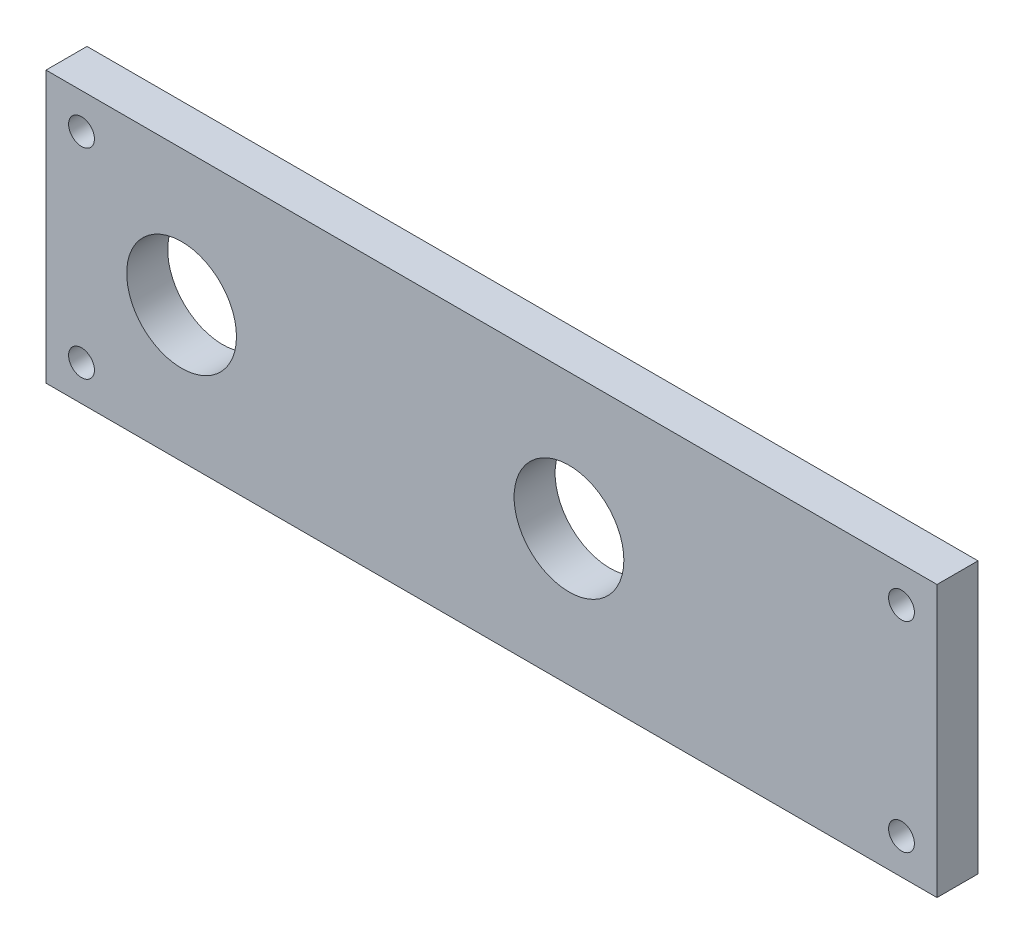
ISO-10303-21;
HEADER;
FILE_DESCRIPTION(('STEP AP214'),'2;1');
FILE_NAME('part.step','',(''),(''),'','','');
FILE_SCHEMA(('AUTOMOTIVE_DESIGN { 1 0 10303 214 1 1 1 1 }'));
ENDSEC;
DATA;
#1=APPLICATION_CONTEXT('core data for automotive mechanical design processes');
#2=APPLICATION_PROTOCOL_DEFINITION('international standard','automotive_design',2000,#1);
#3=PRODUCT_CONTEXT('',#1,'mechanical');
#4=PRODUCT('Part','Part','',(#3));
#5=PRODUCT_RELATED_PRODUCT_CATEGORY('part','',(#4));
#6=PRODUCT_DEFINITION_FORMATION('','',#4);
#7=PRODUCT_DEFINITION_CONTEXT('part definition',#1,'design');
#8=PRODUCT_DEFINITION('design','',#6,#7);
#9=PRODUCT_DEFINITION_SHAPE('','',#8);
#10=(LENGTH_UNIT() NAMED_UNIT(*) SI_UNIT(.MILLI.,.METRE.));
#11=(NAMED_UNIT(*) PLANE_ANGLE_UNIT() SI_UNIT($,.RADIAN.));
#12=(NAMED_UNIT(*) SI_UNIT($,.STERADIAN.) SOLID_ANGLE_UNIT());
#13=UNCERTAINTY_MEASURE_WITH_UNIT(LENGTH_MEASURE(1.E-05),#10,'distance_accuracy_value','');
#14=(GEOMETRIC_REPRESENTATION_CONTEXT(3) GLOBAL_UNCERTAINTY_ASSIGNED_CONTEXT((#13)) GLOBAL_UNIT_ASSIGNED_CONTEXT((#10,
#11,#12)) REPRESENTATION_CONTEXT('',''));
#15=CARTESIAN_POINT('',(0.,0.,0.));
#16=DIRECTION('',(0.,0.,1.));
#17=DIRECTION('',(1.,0.,0.));
#18=AXIS2_PLACEMENT_3D('',#15,#16,#17);
#19=CARTESIAN_POINT('',(0.,0.,3.175));
#20=DIRECTION('',(0.,0.,1.));
#21=DIRECTION('',(1.,0.,0.));
#22=AXIS2_PLACEMENT_3D('',#19,#20,#21);
#23=PLANE('',#22);
#24=CARTESIAN_POINT('',(111.5,15.5,3.175));
#25=DIRECTION('',(0.,0.,1.));
#26=DIRECTION('',(1.,0.,0.));
#27=AXIS2_PLACEMENT_3D('',#24,#25,#26);
#28=CIRCLE('',#27,2.);
#29=CARTESIAN_POINT('',(113.5,15.5,3.175));
#30=VERTEX_POINT('',#29);
#31=EDGE_CURVE('E141',#30,#30,#28,.T.);
#32=ORIENTED_EDGE('',*,*,#31,.F.);
#33=EDGE_LOOP('',(#32));
#34=FACE_BOUND('',#33,.T.);
#35=CARTESIAN_POINT('',(-15.5,15.5,3.175));
#36=DIRECTION('',(0.,0.,1.));
#37=DIRECTION('',(1.,0.,0.));
#38=AXIS2_PLACEMENT_3D('',#35,#36,#37);
#39=CIRCLE('',#38,2.);
#40=CARTESIAN_POINT('',(-13.5,15.5,3.175));
#41=VERTEX_POINT('',#40);
#42=EDGE_CURVE('E129',#41,#41,#39,.T.);
#43=ORIENTED_EDGE('',*,*,#42,.F.);
#44=EDGE_LOOP('',(#43));
#45=FACE_BOUND('',#44,.T.);
#46=CARTESIAN_POINT('',(0.,0.,3.175));
#47=DIRECTION('',(0.,0.,1.));
#48=DIRECTION('',(1.,0.,0.));
#49=AXIS2_PLACEMENT_3D('',#46,#47,#48);
#50=CIRCLE('',#49,8.5);
#51=CARTESIAN_POINT('',(8.5,0.,3.175));
#52=VERTEX_POINT('',#51);
#53=EDGE_CURVE('E108',#52,#52,#50,.T.);
#54=ORIENTED_EDGE('',*,*,#53,.F.);
#55=EDGE_LOOP('',(#54));
#56=FACE_BOUND('',#55,.T.);
#57=DIRECTION('',(0.,-1.,0.));
#58=VECTOR('',#57,1.);
#59=CARTESIAN_POINT('',(-21.,21.,3.175));
#60=LINE('',#59,#58);
#61=CARTESIAN_POINT('',(-21.,21.,3.175));
#62=VERTEX_POINT('',#61);
#63=CARTESIAN_POINT('',(-21.,-21.,3.175));
#64=VERTEX_POINT('',#63);
#65=EDGE_CURVE('E93',#62,#64,#60,.T.);
#66=ORIENTED_EDGE('',*,*,#65,.T.);
#67=DIRECTION('',(1.,0.,0.));
#68=VECTOR('',#67,1.);
#69=CARTESIAN_POINT('',(-21.,-21.,3.175));
#70=LINE('',#69,#68);
#71=CARTESIAN_POINT('',(117.,-21.,3.175));
#72=VERTEX_POINT('',#71);
#73=EDGE_CURVE('E88',#64,#72,#70,.T.);
#74=ORIENTED_EDGE('',*,*,#73,.T.);
#75=DIRECTION('',(0.,1.,0.));
#76=VECTOR('',#75,1.);
#77=CARTESIAN_POINT('',(117.,21.,3.175));
#78=LINE('',#77,#76);
#79=CARTESIAN_POINT('',(117.,21.,3.175));
#80=VERTEX_POINT('',#79);
#81=EDGE_CURVE('E91',#72,#80,#78,.T.);
#82=ORIENTED_EDGE('',*,*,#81,.T.);
#83=DIRECTION('',(-1.,0.,0.));
#84=VECTOR('',#83,1.);
#85=CARTESIAN_POINT('',(-21.,21.,3.175));
#86=LINE('',#85,#84);
#87=EDGE_CURVE('E58',#80,#62,#86,.T.);
#88=ORIENTED_EDGE('',*,*,#87,.T.);
#89=EDGE_LOOP('',(#66,#74,#82,#88));
#90=FACE_BOUND('',#89,.T.);
#91=CARTESIAN_POINT('',(-15.5,-15.5,3.175));
#92=DIRECTION('',(0.,0.,1.));
#93=DIRECTION('',(1.,0.,0.));
#94=AXIS2_PLACEMENT_3D('',#91,#92,#93);
#95=CIRCLE('',#94,2.);
#96=CARTESIAN_POINT('',(-13.5,-15.5,3.175));
#97=VERTEX_POINT('',#96);
#98=EDGE_CURVE('E123',#97,#97,#95,.T.);
#99=ORIENTED_EDGE('',*,*,#98,.F.);
#100=EDGE_LOOP('',(#99));
#101=FACE_BOUND('',#100,.T.);
#102=CARTESIAN_POINT('',(60.,0.,3.175));
#103=DIRECTION('',(0.,0.,1.));
#104=DIRECTION('',(1.,0.,0.));
#105=AXIS2_PLACEMENT_3D('',#102,#103,#104);
#106=CIRCLE('',#105,8.50000000000001);
#107=CARTESIAN_POINT('',(68.5,0.,3.175));
#108=VERTEX_POINT('',#107);
#109=EDGE_CURVE('E135',#108,#108,#106,.T.);
#110=ORIENTED_EDGE('',*,*,#109,.F.);
#111=EDGE_LOOP('',(#110));
#112=FACE_BOUND('',#111,.T.);
#113=CARTESIAN_POINT('',(111.5,-15.5,3.175));
#114=DIRECTION('',(0.,0.,1.));
#115=DIRECTION('',(1.,0.,0.));
#116=AXIS2_PLACEMENT_3D('',#113,#114,#115);
#117=CIRCLE('',#116,2.);
#118=CARTESIAN_POINT('',(113.5,-15.5,3.175));
#119=VERTEX_POINT('',#118);
#120=EDGE_CURVE('E147',#119,#119,#117,.T.);
#121=ORIENTED_EDGE('',*,*,#120,.F.);
#122=EDGE_LOOP('',(#121));
#123=FACE_BOUND('',#122,.T.);
#124=ADVANCED_FACE('F41',(#34,#45,#56,#90,#101,#112,#123),#23,.T.);
#125=CARTESIAN_POINT('',(0.,0.,-3.175));
#126=DIRECTION('',(0.,0.,1.));
#127=DIRECTION('',(1.,0.,0.));
#128=AXIS2_PLACEMENT_3D('',#125,#126,#127);
#129=PLANE('',#128);
#130=DIRECTION('',(0.,-1.,0.));
#131=VECTOR('',#130,1.);
#132=CARTESIAN_POINT('',(-21.,21.,-3.175));
#133=LINE('',#132,#131);
#134=CARTESIAN_POINT('',(-21.,21.,-3.175));
#135=VERTEX_POINT('',#134);
#136=CARTESIAN_POINT('',(-21.,-21.,-3.175));
#137=VERTEX_POINT('',#136);
#138=EDGE_CURVE('E105',#135,#137,#133,.T.);
#139=ORIENTED_EDGE('',*,*,#138,.F.);
#140=DIRECTION('',(-1.,0.,0.));
#141=VECTOR('',#140,1.);
#142=CARTESIAN_POINT('',(-21.,21.,-3.175));
#143=LINE('',#142,#141);
#144=CARTESIAN_POINT('',(117.,21.,-3.175));
#145=VERTEX_POINT('',#144);
#146=EDGE_CURVE('E81',#145,#135,#143,.T.);
#147=ORIENTED_EDGE('',*,*,#146,.F.);
#148=DIRECTION('',(0.,1.,0.));
#149=VECTOR('',#148,1.);
#150=CARTESIAN_POINT('',(117.,21.,-3.175));
#151=LINE('',#150,#149);
#152=CARTESIAN_POINT('',(117.,-21.,-3.175));
#153=VERTEX_POINT('',#152);
#154=EDGE_CURVE('E75',#153,#145,#151,.T.);
#155=ORIENTED_EDGE('',*,*,#154,.F.);
#156=DIRECTION('',(1.,0.,0.));
#157=VECTOR('',#156,1.);
#158=CARTESIAN_POINT('',(-21.,-21.,-3.175));
#159=LINE('',#158,#157);
#160=EDGE_CURVE('E97',#137,#153,#159,.T.);
#161=ORIENTED_EDGE('',*,*,#160,.F.);
#162=EDGE_LOOP('',(#139,#147,#155,#161));
#163=FACE_BOUND('',#162,.T.);
#164=CARTESIAN_POINT('',(0.,0.,-3.175));
#165=DIRECTION('',(0.,0.,1.));
#166=DIRECTION('',(1.,0.,0.));
#167=AXIS2_PLACEMENT_3D('',#164,#165,#166);
#168=CIRCLE('',#167,8.5);
#169=CARTESIAN_POINT('',(8.5,0.,-3.175));
#170=VERTEX_POINT('',#169);
#171=EDGE_CURVE('E120',#170,#170,#168,.T.);
#172=ORIENTED_EDGE('',*,*,#171,.T.);
#173=EDGE_LOOP('',(#172));
#174=FACE_BOUND('',#173,.T.);
#175=CARTESIAN_POINT('',(-15.5,-15.5,-3.175));
#176=DIRECTION('',(0.,0.,1.));
#177=DIRECTION('',(1.,0.,0.));
#178=AXIS2_PLACEMENT_3D('',#175,#176,#177);
#179=CIRCLE('',#178,2.);
#180=CARTESIAN_POINT('',(-13.5,-15.5,-3.175));
#181=VERTEX_POINT('',#180);
#182=EDGE_CURVE('E126',#181,#181,#179,.T.);
#183=ORIENTED_EDGE('',*,*,#182,.T.);
#184=EDGE_LOOP('',(#183));
#185=FACE_BOUND('',#184,.T.);
#186=CARTESIAN_POINT('',(-15.5,15.5,-3.175));
#187=DIRECTION('',(0.,0.,1.));
#188=DIRECTION('',(1.,0.,0.));
#189=AXIS2_PLACEMENT_3D('',#186,#187,#188);
#190=CIRCLE('',#189,2.);
#191=CARTESIAN_POINT('',(-13.5,15.5,-3.175));
#192=VERTEX_POINT('',#191);
#193=EDGE_CURVE('E132',#192,#192,#190,.T.);
#194=ORIENTED_EDGE('',*,*,#193,.T.);
#195=EDGE_LOOP('',(#194));
#196=FACE_BOUND('',#195,.T.);
#197=CARTESIAN_POINT('',(60.,0.,-3.175));
#198=DIRECTION('',(0.,0.,1.));
#199=DIRECTION('',(1.,0.,0.));
#200=AXIS2_PLACEMENT_3D('',#197,#198,#199);
#201=CIRCLE('',#200,8.50000000000001);
#202=CARTESIAN_POINT('',(68.5,0.,-3.175));
#203=VERTEX_POINT('',#202);
#204=EDGE_CURVE('E138',#203,#203,#201,.T.);
#205=ORIENTED_EDGE('',*,*,#204,.T.);
#206=EDGE_LOOP('',(#205));
#207=FACE_BOUND('',#206,.T.);
#208=CARTESIAN_POINT('',(111.5,15.5,-3.175));
#209=DIRECTION('',(0.,0.,1.));
#210=DIRECTION('',(1.,0.,0.));
#211=AXIS2_PLACEMENT_3D('',#208,#209,#210);
#212=CIRCLE('',#211,2.);
#213=CARTESIAN_POINT('',(113.5,15.5,-3.175));
#214=VERTEX_POINT('',#213);
#215=EDGE_CURVE('E144',#214,#214,#212,.T.);
#216=ORIENTED_EDGE('',*,*,#215,.T.);
#217=EDGE_LOOP('',(#216));
#218=FACE_BOUND('',#217,.T.);
#219=CARTESIAN_POINT('',(111.5,-15.5,-3.175));
#220=DIRECTION('',(0.,0.,1.));
#221=DIRECTION('',(1.,0.,0.));
#222=AXIS2_PLACEMENT_3D('',#219,#220,#221);
#223=CIRCLE('',#222,2.);
#224=CARTESIAN_POINT('',(113.5,-15.5,-3.175));
#225=VERTEX_POINT('',#224);
#226=EDGE_CURVE('E150',#225,#225,#223,.T.);
#227=ORIENTED_EDGE('',*,*,#226,.T.);
#228=EDGE_LOOP('',(#227));
#229=FACE_BOUND('',#228,.T.);
#230=ADVANCED_FACE('F116',(#163,#174,#185,#196,#207,#218,#229),#129,.F.);
#231=CARTESIAN_POINT('',(-21.,21.,3.175));
#232=DIRECTION('',(1.,0.,0.));
#233=DIRECTION('',(0.,1.,0.));
#234=AXIS2_PLACEMENT_3D('',#231,#232,#233);
#235=PLANE('',#234);
#236=ORIENTED_EDGE('',*,*,#138,.T.);
#237=DIRECTION('',(0.,0.,-1.));
#238=VECTOR('',#237,1.);
#239=CARTESIAN_POINT('',(-21.,-21.,3.175));
#240=LINE('',#239,#238);
#241=EDGE_CURVE('E11',#64,#137,#240,.T.);
#242=ORIENTED_EDGE('',*,*,#241,.F.);
#243=ORIENTED_EDGE('',*,*,#65,.F.);
#244=DIRECTION('',(0.,0.,-1.));
#245=VECTOR('',#244,1.);
#246=CARTESIAN_POINT('',(-21.,21.,3.175));
#247=LINE('',#246,#245);
#248=EDGE_CURVE('E101',#62,#135,#247,.T.);
#249=ORIENTED_EDGE('',*,*,#248,.T.);
#250=EDGE_LOOP('',(#236,#242,#243,#249));
#251=FACE_BOUND('',#250,.T.);
#252=ADVANCED_FACE('F43',(#251),#235,.F.);
#253=CARTESIAN_POINT('',(-21.,-21.,3.175));
#254=DIRECTION('',(0.,1.,0.));
#255=DIRECTION('',(0.,0.,1.));
#256=AXIS2_PLACEMENT_3D('',#253,#254,#255);
#257=PLANE('',#256);
#258=ORIENTED_EDGE('',*,*,#160,.T.);
#259=DIRECTION('',(0.,0.,-1.));
#260=VECTOR('',#259,1.);
#261=CARTESIAN_POINT('',(117.,-21.,3.175));
#262=LINE('',#261,#260);
#263=EDGE_CURVE('E50',#72,#153,#262,.T.);
#264=ORIENTED_EDGE('',*,*,#263,.F.);
#265=ORIENTED_EDGE('',*,*,#73,.F.);
#266=ORIENTED_EDGE('',*,*,#241,.T.);
#267=EDGE_LOOP('',(#258,#264,#265,#266));
#268=FACE_BOUND('',#267,.T.);
#269=ADVANCED_FACE('F96',(#268),#257,.F.);
#270=CARTESIAN_POINT('',(117.,21.,3.175));
#271=DIRECTION('',(-1.,0.,0.));
#272=DIRECTION('',(0.,-1.,0.));
#273=AXIS2_PLACEMENT_3D('',#270,#271,#272);
#274=PLANE('',#273);
#275=ORIENTED_EDGE('',*,*,#154,.T.);
#276=DIRECTION('',(0.,0.,-1.));
#277=VECTOR('',#276,1.);
#278=CARTESIAN_POINT('',(117.,21.,3.175));
#279=LINE('',#278,#277);
#280=EDGE_CURVE('E98',#80,#145,#279,.T.);
#281=ORIENTED_EDGE('',*,*,#280,.F.);
#282=ORIENTED_EDGE('',*,*,#81,.F.);
#283=ORIENTED_EDGE('',*,*,#263,.T.);
#284=EDGE_LOOP('',(#275,#281,#282,#283));
#285=FACE_BOUND('',#284,.T.);
#286=ADVANCED_FACE('F99',(#285),#274,.F.);
#287=CARTESIAN_POINT('',(-21.,21.,3.175));
#288=DIRECTION('',(0.,-1.,0.));
#289=DIRECTION('',(0.,0.,-1.));
#290=AXIS2_PLACEMENT_3D('',#287,#288,#289);
#291=PLANE('',#290);
#292=ORIENTED_EDGE('',*,*,#146,.T.);
#293=ORIENTED_EDGE('',*,*,#248,.F.);
#294=ORIENTED_EDGE('',*,*,#87,.F.);
#295=ORIENTED_EDGE('',*,*,#280,.T.);
#296=EDGE_LOOP('',(#292,#293,#294,#295));
#297=FACE_BOUND('',#296,.T.);
#298=ADVANCED_FACE('F113',(#297),#291,.F.);
#299=CARTESIAN_POINT('',(0.,0.,3.175));
#300=DIRECTION('',(0.,0.,-1.));
#301=DIRECTION('',(-1.,0.,0.));
#302=AXIS2_PLACEMENT_3D('',#299,#300,#301);
#303=CYLINDRICAL_SURFACE('',#302,8.5);
#304=ORIENTED_EDGE('',*,*,#53,.T.);
#305=EDGE_LOOP('',(#304));
#306=FACE_BOUND('',#305,.T.);
#307=ORIENTED_EDGE('',*,*,#171,.F.);
#308=EDGE_LOOP('',(#307));
#309=FACE_BOUND('',#308,.T.);
#310=ADVANCED_FACE('F169',(#306,#309),#303,.F.);
#311=CARTESIAN_POINT('',(-15.5,-15.5,3.175));
#312=DIRECTION('',(0.,0.,-1.));
#313=DIRECTION('',(-1.,0.,0.));
#314=AXIS2_PLACEMENT_3D('',#311,#312,#313);
#315=CYLINDRICAL_SURFACE('',#314,2.);
#316=ORIENTED_EDGE('',*,*,#98,.T.);
#317=EDGE_LOOP('',(#316));
#318=FACE_BOUND('',#317,.T.);
#319=ORIENTED_EDGE('',*,*,#182,.F.);
#320=EDGE_LOOP('',(#319));
#321=FACE_BOUND('',#320,.T.);
#322=ADVANCED_FACE('F214',(#318,#321),#315,.F.);
#323=CARTESIAN_POINT('',(-15.5,15.5,3.175));
#324=DIRECTION('',(0.,0.,-1.));
#325=DIRECTION('',(-1.,0.,0.));
#326=AXIS2_PLACEMENT_3D('',#323,#324,#325);
#327=CYLINDRICAL_SURFACE('',#326,2.);
#328=ORIENTED_EDGE('',*,*,#42,.T.);
#329=EDGE_LOOP('',(#328));
#330=FACE_BOUND('',#329,.T.);
#331=ORIENTED_EDGE('',*,*,#193,.F.);
#332=EDGE_LOOP('',(#331));
#333=FACE_BOUND('',#332,.T.);
#334=ADVANCED_FACE('F222',(#330,#333),#327,.F.);
#335=CARTESIAN_POINT('',(60.,0.,3.175));
#336=DIRECTION('',(0.,0.,-1.));
#337=DIRECTION('',(-1.,0.,0.));
#338=AXIS2_PLACEMENT_3D('',#335,#336,#337);
#339=CYLINDRICAL_SURFACE('',#338,8.50000000000001);
#340=ORIENTED_EDGE('',*,*,#109,.T.);
#341=EDGE_LOOP('',(#340));
#342=FACE_BOUND('',#341,.T.);
#343=ORIENTED_EDGE('',*,*,#204,.F.);
#344=EDGE_LOOP('',(#343));
#345=FACE_BOUND('',#344,.T.);
#346=ADVANCED_FACE('F230',(#342,#345),#339,.F.);
#347=CARTESIAN_POINT('',(111.5,15.5,3.175));
#348=DIRECTION('',(0.,0.,-1.));
#349=DIRECTION('',(-1.,0.,0.));
#350=AXIS2_PLACEMENT_3D('',#347,#348,#349);
#351=CYLINDRICAL_SURFACE('',#350,2.);
#352=ORIENTED_EDGE('',*,*,#31,.T.);
#353=EDGE_LOOP('',(#352));
#354=FACE_BOUND('',#353,.T.);
#355=ORIENTED_EDGE('',*,*,#215,.F.);
#356=EDGE_LOOP('',(#355));
#357=FACE_BOUND('',#356,.T.);
#358=ADVANCED_FACE('F239',(#354,#357),#351,.F.);
#359=CARTESIAN_POINT('',(111.5,-15.5,3.175));
#360=DIRECTION('',(0.,0.,-1.));
#361=DIRECTION('',(-1.,0.,0.));
#362=AXIS2_PLACEMENT_3D('',#359,#360,#361);
#363=CYLINDRICAL_SURFACE('',#362,2.);
#364=ORIENTED_EDGE('',*,*,#120,.T.);
#365=EDGE_LOOP('',(#364));
#366=FACE_BOUND('',#365,.T.);
#367=ORIENTED_EDGE('',*,*,#226,.F.);
#368=EDGE_LOOP('',(#367));
#369=FACE_BOUND('',#368,.T.);
#370=ADVANCED_FACE('F156',(#366,#369),#363,.F.);
#371=CLOSED_SHELL('',(#124,#230,#252,#269,#286,#298,#310,#322,#334,#346,#358,#370));
#372=MANIFOLD_SOLID_BREP('B2',#371);
#373=ADVANCED_BREP_SHAPE_REPRESENTATION('',(#18,#372),#14);
#374=SHAPE_DEFINITION_REPRESENTATION(#9,#373);
ENDSEC;
END-ISO-10303-21;
